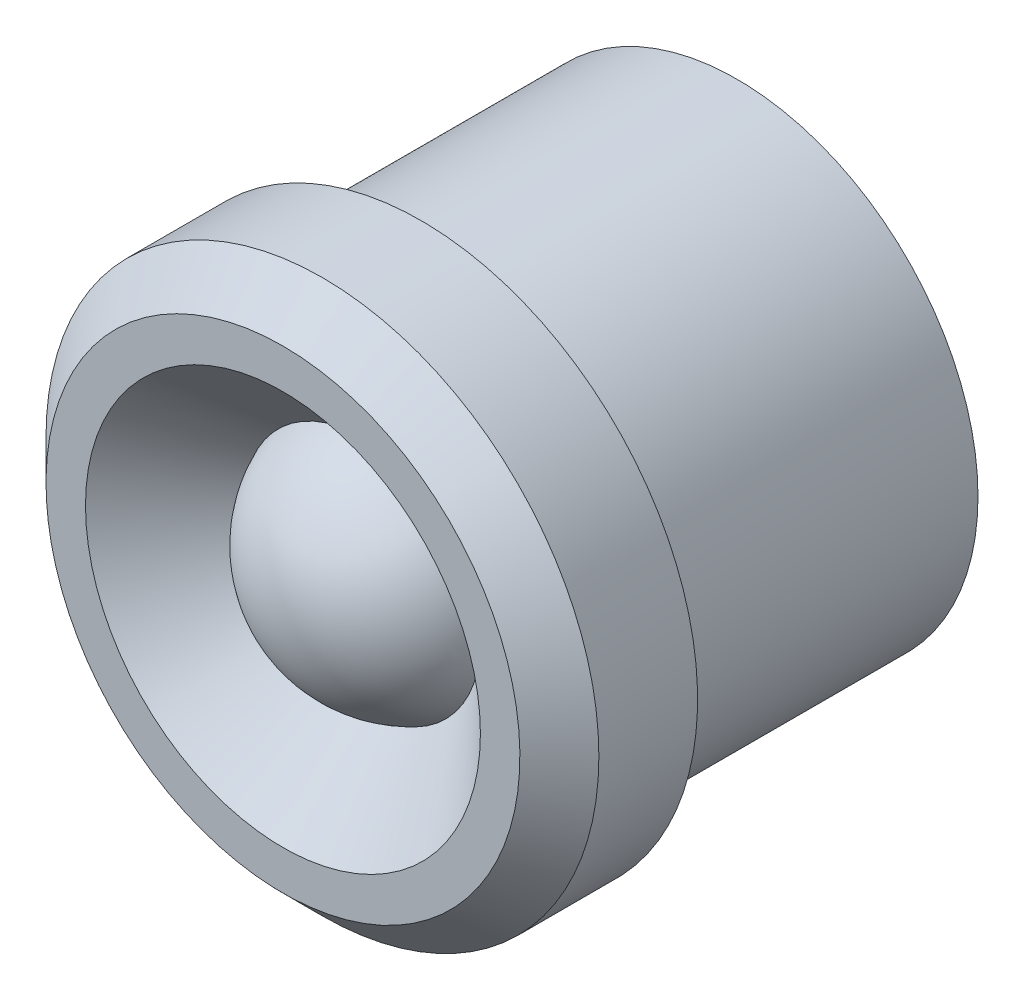
ISO-10303-21;
HEADER;
FILE_DESCRIPTION(('STEP AP214'),'2;1');
FILE_NAME('part.step','',(''),(''),'','','');
FILE_SCHEMA(('AUTOMOTIVE_DESIGN { 1 0 10303 214 1 1 1 1 }'));
ENDSEC;
DATA;
#1=APPLICATION_CONTEXT('core data for automotive mechanical design processes');
#2=APPLICATION_PROTOCOL_DEFINITION('international standard','automotive_design',2000,#1);
#3=PRODUCT_CONTEXT('',#1,'mechanical');
#4=PRODUCT('Part','Part','',(#3));
#5=PRODUCT_RELATED_PRODUCT_CATEGORY('part','',(#4));
#6=PRODUCT_DEFINITION_FORMATION('','',#4);
#7=PRODUCT_DEFINITION_CONTEXT('part definition',#1,'design');
#8=PRODUCT_DEFINITION('design','',#6,#7);
#9=PRODUCT_DEFINITION_SHAPE('','',#8);
#10=(LENGTH_UNIT() NAMED_UNIT(*) SI_UNIT(.MILLI.,.METRE.));
#11=(NAMED_UNIT(*) PLANE_ANGLE_UNIT() SI_UNIT($,.RADIAN.));
#12=(NAMED_UNIT(*) SI_UNIT($,.STERADIAN.) SOLID_ANGLE_UNIT());
#13=UNCERTAINTY_MEASURE_WITH_UNIT(LENGTH_MEASURE(1.E-05),#10,'distance_accuracy_value','');
#14=(GEOMETRIC_REPRESENTATION_CONTEXT(3) GLOBAL_UNCERTAINTY_ASSIGNED_CONTEXT((#13)) GLOBAL_UNIT_ASSIGNED_CONTEXT((#10,
#11,#12)) REPRESENTATION_CONTEXT('',''));
#15=CARTESIAN_POINT('',(0.,0.,0.));
#16=DIRECTION('',(0.,0.,1.));
#17=DIRECTION('',(1.,0.,0.));
#18=AXIS2_PLACEMENT_3D('',#15,#16,#17);
#19=CARTESIAN_POINT('',(0.,-4.06145794350593E-06,1.8683339392352));
#20=DIRECTION('',(0.,0.,1.));
#21=DIRECTION('',(1.,0.,0.));
#22=AXIS2_PLACEMENT_3D('',#19,#20,#21);
#23=PLANE('',#22);
#24=CARTESIAN_POINT('',(0.,-4.06145794350593E-06,1.8683339392352));
#25=DIRECTION('',(0.,0.,-1.));
#26=DIRECTION('',(-1.,0.,0.));
#27=AXIS2_PLACEMENT_3D('',#24,#25,#26);
#28=CIRCLE('',#27,6.);
#29=CARTESIAN_POINT('',(-6.,-4.06145794350593E-06,1.8683339392352));
#30=VERTEX_POINT('',#29);
#31=EDGE_CURVE('E39',#30,#30,#28,.F.);
#32=ORIENTED_EDGE('',*,*,#31,.F.);
#33=EDGE_LOOP('',(#32));
#34=FACE_BOUND('',#33,.T.);
#35=ADVANCED_FACE('F36',(#34),#23,.F.);
#36=CARTESIAN_POINT('',(0.,-4.06145794350593E-06,1.8683339392352));
#37=DIRECTION('',(0.,0.,-1.));
#38=DIRECTION('',(-1.,0.,0.));
#39=AXIS2_PLACEMENT_3D('',#36,#37,#38);
#40=CYLINDRICAL_SURFACE('',#39,6.);
#41=CARTESIAN_POINT('',(0.,-4.06145794350593E-06,-14.1316660607648));
#42=DIRECTION('',(0.,0.,-1.));
#43=DIRECTION('',(-1.,0.,0.));
#44=AXIS2_PLACEMENT_3D('',#41,#42,#43);
#45=CIRCLE('',#44,6.);
#46=CARTESIAN_POINT('',(-6.,-4.06145794350593E-06,-14.1316660607648));
#47=VERTEX_POINT('',#46);
#48=EDGE_CURVE('E76',#47,#47,#45,.F.);
#49=ORIENTED_EDGE('',*,*,#48,.F.);
#50=EDGE_LOOP('',(#49));
#51=FACE_BOUND('',#50,.T.);
#52=ORIENTED_EDGE('',*,*,#31,.T.);
#53=EDGE_LOOP('',(#52));
#54=FACE_BOUND('',#53,.T.);
#55=ADVANCED_FACE('F83',(#51,#54),#40,.F.);
#56=CARTESIAN_POINT('',(0.,-4.06145794350593E-06,-14.1316660607648));
#57=DIRECTION('',(0.,0.,-1.));
#58=DIRECTION('',(-1.,0.,0.));
#59=AXIS2_PLACEMENT_3D('',#56,#57,#58);
#60=PLANE('',#59);
#61=ORIENTED_EDGE('',*,*,#48,.T.);
#62=EDGE_LOOP('',(#61));
#63=FACE_BOUND('',#62,.T.);
#64=CARTESIAN_POINT('',(0.,-4.06145794350593E-06,-14.1316660607648));
#65=DIRECTION('',(0.,0.,1.));
#66=DIRECTION('',(1.,0.,0.));
#67=AXIS2_PLACEMENT_3D('',#64,#65,#66);
#68=CIRCLE('',#67,12.2);
#69=CARTESIAN_POINT('',(12.2,-4.06145794350593E-06,-14.1316660607648));
#70=VERTEX_POINT('',#69);
#71=EDGE_CURVE('E74',#70,#70,#68,.T.);
#72=ORIENTED_EDGE('',*,*,#71,.F.);
#73=EDGE_LOOP('',(#72));
#74=FACE_BOUND('',#73,.T.);
#75=ADVANCED_FACE('F89',(#63,#74),#60,.T.);
#76=CARTESIAN_POINT('',(0.,-4.06145794350593E-06,1.8683339392352));
#77=DIRECTION('',(0.,0.,1.));
#78=DIRECTION('',(1.,0.,0.));
#79=AXIS2_PLACEMENT_3D('',#76,#77,#78);
#80=CYLINDRICAL_SURFACE('',#79,12.2);
#81=CARTESIAN_POINT('',(0.,-4.06145794350593E-06,1.8683339392352));
#82=DIRECTION('',(0.,0.,1.));
#83=DIRECTION('',(1.,0.,0.));
#84=AXIS2_PLACEMENT_3D('',#81,#82,#83);
#85=CIRCLE('',#84,12.2);
#86=CARTESIAN_POINT('',(12.2,-4.06145794350593E-06,1.8683339392352));
#87=VERTEX_POINT('',#86);
#88=EDGE_CURVE('E71',#87,#87,#85,.T.);
#89=ORIENTED_EDGE('',*,*,#88,.F.);
#90=EDGE_LOOP('',(#89));
#91=FACE_BOUND('',#90,.T.);
#92=ORIENTED_EDGE('',*,*,#71,.T.);
#93=EDGE_LOOP('',(#92));
#94=FACE_BOUND('',#93,.T.);
#95=ADVANCED_FACE('F94',(#91,#94),#80,.T.);
#96=CARTESIAN_POINT('',(0.,-4.06145794350593E-06,1.8683339392352));
#97=DIRECTION('',(0.,0.,1.));
#98=DIRECTION('',(1.,0.,0.));
#99=AXIS2_PLACEMENT_3D('',#96,#97,#98);
#100=PLANE('',#99);
#101=ORIENTED_EDGE('',*,*,#88,.T.);
#102=EDGE_LOOP('',(#101));
#103=FACE_BOUND('',#102,.T.);
#104=CARTESIAN_POINT('',(0.,-4.06145794350593E-06,1.8683339392352));
#105=DIRECTION('',(0.,0.,-1.));
#106=DIRECTION('',(-1.,0.,0.));
#107=AXIS2_PLACEMENT_3D('',#104,#105,#106);
#108=CIRCLE('',#107,14.);
#109=CARTESIAN_POINT('',(-14.,-4.06145794350593E-06,1.8683339392352));
#110=VERTEX_POINT('',#109);
#111=EDGE_CURVE('E68',#110,#110,#108,.F.);
#112=ORIENTED_EDGE('',*,*,#111,.F.);
#113=EDGE_LOOP('',(#112));
#114=FACE_BOUND('',#113,.T.);
#115=ADVANCED_FACE('F99',(#103,#114),#100,.F.);
#116=CARTESIAN_POINT('',(0.,-4.06145794350593E-06,1.8683339392352));
#117=DIRECTION('',(0.,0.,-1.));
#118=DIRECTION('',(-1.,0.,0.));
#119=AXIS2_PLACEMENT_3D('',#116,#117,#118);
#120=CYLINDRICAL_SURFACE('',#119,14.);
#121=ORIENTED_EDGE('',*,*,#111,.T.);
#122=EDGE_LOOP('',(#121));
#123=FACE_BOUND('',#122,.T.);
#124=CARTESIAN_POINT('',(0.,-4.06145794350593E-06,6.8683339392351));
#125=DIRECTION('',(0.,0.,-1.));
#126=DIRECTION('',(-1.,0.,0.));
#127=AXIS2_PLACEMENT_3D('',#124,#125,#126);
#128=CIRCLE('',#127,14.);
#129=CARTESIAN_POINT('',(-14.,-4.06145794350593E-06,6.8683339392352));
#130=VERTEX_POINT('',#129);
#131=EDGE_CURVE('E64',#130,#130,#128,.F.);
#132=ORIENTED_EDGE('',*,*,#131,.F.);
#133=EDGE_LOOP('',(#132));
#134=FACE_BOUND('',#133,.T.);
#135=ADVANCED_FACE('F103',(#123,#134),#120,.T.);
#136=CARTESIAN_POINT('',(0.,-4.06145794350593E-06,6.8683339392352));
#137=DIRECTION('',(0.,0.,-1.));
#138=DIRECTION('',(0.,1.,0.));
#139=AXIS2_PLACEMENT_3D('',#136,#137,#138);
#140=CONICAL_SURFACE('',#139,14.,0.785398163397448);
#141=ORIENTED_EDGE('',*,*,#131,.T.);
#142=EDGE_LOOP('',(#141));
#143=FACE_BOUND('',#142,.T.);
#144=CARTESIAN_POINT('',(0.,-4.06145794344398E-06,8.86833393923532));
#145=DIRECTION('',(0.,0.,-1.));
#146=DIRECTION('',(0.,1.,0.));
#147=AXIS2_PLACEMENT_3D('',#144,#145,#146);
#148=CIRCLE('',#147,11.9999999999999);
#149=CARTESIAN_POINT('',(0.,11.9999959385419,8.86833393923532));
#150=VERTEX_POINT('',#149);
#151=EDGE_CURVE('E61',#150,#150,#148,.F.);
#152=ORIENTED_EDGE('',*,*,#151,.F.);
#153=EDGE_LOOP('',(#152));
#154=FACE_BOUND('',#153,.T.);
#155=ADVANCED_FACE('F107',(#143,#154),#140,.T.);
#156=CARTESIAN_POINT('',(0.,-4.06145794350593E-06,8.8683339392352));
#157=DIRECTION('',(0.,0.,1.));
#158=DIRECTION('',(1.,0.,0.));
#159=AXIS2_PLACEMENT_3D('',#156,#157,#158);
#160=PLANE('',#159);
#161=CARTESIAN_POINT('',(0.,-4.06145794350593E-06,8.8683339392351));
#162=DIRECTION('',(0.,0.,1.));
#163=DIRECTION('',(1.,0.,0.));
#164=AXIS2_PLACEMENT_3D('',#161,#162,#163);
#165=CIRCLE('',#164,9.9999999999999);
#166=CARTESIAN_POINT('',(9.9999999999999,-4.06145794350593E-06,8.8683339392351));
#167=VERTEX_POINT('',#166);
#168=EDGE_CURVE('E43',#167,#167,#165,.T.);
#169=ORIENTED_EDGE('',*,*,#168,.F.);
#170=EDGE_LOOP('',(#169));
#171=FACE_BOUND('',#170,.T.);
#172=ORIENTED_EDGE('',*,*,#151,.T.);
#173=EDGE_LOOP('',(#172));
#174=FACE_BOUND('',#173,.T.);
#175=ADVANCED_FACE('F56',(#171,#174),#160,.T.);
#176=CARTESIAN_POINT('',(0.,-4.06145794350593E-06,4.8683339392352));
#177=DIRECTION('',(0.,0.,1.));
#178=DIRECTION('',(1.,0.,0.));
#179=AXIS2_PLACEMENT_3D('',#176,#177,#178);
#180=CONICAL_SURFACE('',#179,6.,0.785398163397448);
#181=CARTESIAN_POINT('',(0.,-4.06145794350593E-06,4.8683339392352));
#182=DIRECTION('',(0.,0.,1.));
#183=DIRECTION('',(1.,0.,0.));
#184=AXIS2_PLACEMENT_3D('',#181,#182,#183);
#185=CIRCLE('',#184,6.);
#186=CARTESIAN_POINT('',(6.,-4.06145793977323E-06,4.8683339392352));
#187=VERTEX_POINT('',#186);
#188=EDGE_CURVE('E11',#187,#187,#185,.T.);
#189=ORIENTED_EDGE('',*,*,#188,.F.);
#190=EDGE_LOOP('',(#189));
#191=FACE_BOUND('',#190,.T.);
#192=ORIENTED_EDGE('',*,*,#168,.T.);
#193=EDGE_LOOP('',(#192));
#194=FACE_BOUND('',#193,.T.);
#195=ADVANCED_FACE('F50',(#191,#194),#180,.F.);
#196=CARTESIAN_POINT('',(0.,-4.06145794001816E-06,8.8683339392352));
#197=CARTESIAN_POINT('',(13.0000000000001,-4.06145794001816E-06,8.86833393923502));
#198=CARTESIAN_POINT('',(12.9999999999999,-4.06145793922214E-06,-4.13166606076498));
#199=CARTESIAN_POINT('',(0.,-4.06145793922214E-06,-4.1316660607648));
#200=(BOUNDED_CURVE() B_SPLINE_CURVE(3,(#196,#197,#198,#199),.UNSPECIFIED.,.F.,
.F.) B_SPLINE_CURVE_WITH_KNOTS((4,4),(0.,1.),
.UNSPECIFIED.) CURVE() GEOMETRIC_REPRESENTATION_ITEM() RATIONAL_B_SPLINE_CURVE((1.,
0.333333333333334,0.333333333333334,1.)) REPRESENTATION_ITEM(''));
#201=CARTESIAN_POINT('',(0.,-4.06145794350593E-06,2.3683339392352));
#202=DIRECTION('',(0.,0.,1.));
#203=AXIS1_PLACEMENT('',#201,#202);
#204=SURFACE_OF_REVOLUTION('',#200,#203);
#205=CARTESIAN_POINT('',(0.,-4.0614579469937E-06,8.8683339392352));
#206=VERTEX_POINT('',#205);
#207=VERTEX_LOOP('',#206);
#208=FACE_BOUND('',#207,.T.);
#209=ORIENTED_EDGE('',*,*,#188,.T.);
#210=EDGE_LOOP('',(#209));
#211=FACE_BOUND('',#210,.T.);
#212=ADVANCED_FACE('F47',(#208,#211),#204,.F.);
#213=CLOSED_SHELL('',(#35,#55,#75,#95,#115,#135,#155,#175,#195,#212));
#214=MANIFOLD_SOLID_BREP('B2',#213);
#215=ADVANCED_BREP_SHAPE_REPRESENTATION('',(#18,#214),#14);
#216=SHAPE_DEFINITION_REPRESENTATION(#9,#215);
ENDSEC;
END-ISO-10303-21;
